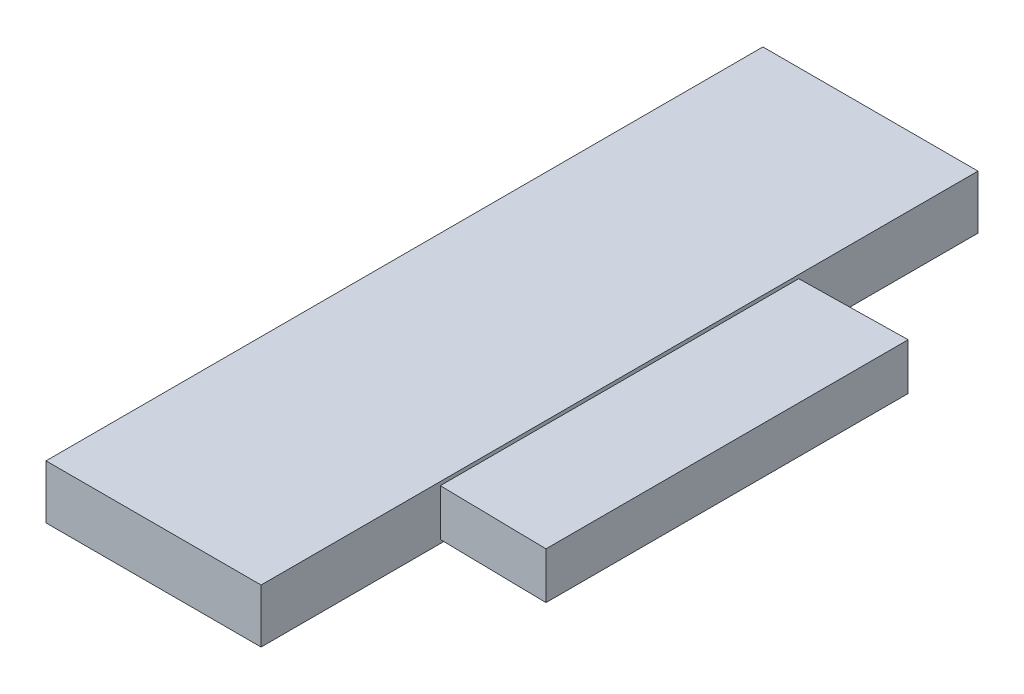
ISO-10303-21;
HEADER;
FILE_DESCRIPTION(('STEP AP214'),'2;1');
FILE_NAME('part.step','',(''),(''),'','','');
FILE_SCHEMA(('AUTOMOTIVE_DESIGN { 1 0 10303 214 1 1 1 1 }'));
ENDSEC;
DATA;
#1=APPLICATION_CONTEXT('core data for automotive mechanical design processes');
#2=APPLICATION_PROTOCOL_DEFINITION('international standard','automotive_design',2000,#1);
#3=PRODUCT_CONTEXT('',#1,'mechanical');
#4=PRODUCT('Part','Part','',(#3));
#5=PRODUCT_RELATED_PRODUCT_CATEGORY('part','',(#4));
#6=PRODUCT_DEFINITION_FORMATION('','',#4);
#7=PRODUCT_DEFINITION_CONTEXT('part definition',#1,'design');
#8=PRODUCT_DEFINITION('design','',#6,#7);
#9=PRODUCT_DEFINITION_SHAPE('','',#8);
#10=(LENGTH_UNIT() NAMED_UNIT(*) SI_UNIT(.MILLI.,.METRE.));
#11=(NAMED_UNIT(*) PLANE_ANGLE_UNIT() SI_UNIT($,.RADIAN.));
#12=(NAMED_UNIT(*) SI_UNIT($,.STERADIAN.) SOLID_ANGLE_UNIT());
#13=UNCERTAINTY_MEASURE_WITH_UNIT(LENGTH_MEASURE(1.E-05),#10,'distance_accuracy_value','');
#14=(GEOMETRIC_REPRESENTATION_CONTEXT(3) GLOBAL_UNCERTAINTY_ASSIGNED_CONTEXT((#13)) GLOBAL_UNIT_ASSIGNED_CONTEXT((#10,
#11,#12)) REPRESENTATION_CONTEXT('',''));
#15=CARTESIAN_POINT('',(0.,0.,0.));
#16=DIRECTION('',(0.,0.,1.));
#17=DIRECTION('',(1.,0.,0.));
#18=AXIS2_PLACEMENT_3D('',#15,#16,#17);
#19=CARTESIAN_POINT('',(0.,3.75,-50.));
#20=DIRECTION('',(-1.,0.,0.));
#21=DIRECTION('',(0.,0.,1.));
#22=AXIS2_PLACEMENT_3D('',#19,#20,#21);
#23=PLANE('',#22);
#24=DIRECTION('',(0.,0.,-1.));
#25=VECTOR('',#24,1.);
#26=CARTESIAN_POINT('',(0.,-3.75,-50.));
#27=LINE('',#26,#25);
#28=CARTESIAN_POINT('',(0.,-3.75,50.));
#29=VERTEX_POINT('',#28);
#30=CARTESIAN_POINT('',(0.,-3.75,-50.));
#31=VERTEX_POINT('',#30);
#32=EDGE_CURVE('E163',#29,#31,#27,.T.);
#33=ORIENTED_EDGE('',*,*,#32,.T.);
#34=DIRECTION('',(0.,-1.,0.));
#35=VECTOR('',#34,1.);
#36=CARTESIAN_POINT('',(0.,3.75,-50.));
#37=LINE('',#36,#35);
#38=CARTESIAN_POINT('',(0.,3.75,-50.));
#39=VERTEX_POINT('',#38);
#40=EDGE_CURVE('E167',#39,#31,#37,.T.);
#41=ORIENTED_EDGE('',*,*,#40,.F.);
#42=DIRECTION('',(0.,0.,-1.));
#43=VECTOR('',#42,1.);
#44=CARTESIAN_POINT('',(0.,3.75,-50.));
#45=LINE('',#44,#43);
#46=CARTESIAN_POINT('',(0.,3.75,50.));
#47=VERTEX_POINT('',#46);
#48=EDGE_CURVE('E155',#47,#39,#45,.T.);
#49=ORIENTED_EDGE('',*,*,#48,.F.);
#50=DIRECTION('',(0.,-1.,0.));
#51=VECTOR('',#50,1.);
#52=CARTESIAN_POINT('',(0.,3.75,50.));
#53=LINE('',#52,#51);
#54=EDGE_CURVE('E47',#47,#29,#53,.T.);
#55=ORIENTED_EDGE('',*,*,#54,.T.);
#56=EDGE_LOOP('',(#33,#41,#49,#55));
#57=FACE_BOUND('',#56,.T.);
#58=DIRECTION('',(0.,0.,1.));
#59=VECTOR('',#58,1.);
#60=CARTESIAN_POINT('',(0.,3.25,25.));
#61=LINE('',#60,#59);
#62=CARTESIAN_POINT('',(0.,3.25,-25.));
#63=VERTEX_POINT('',#62);
#64=CARTESIAN_POINT('',(0.,3.25,25.));
#65=VERTEX_POINT('',#64);
#66=EDGE_CURVE('E54',#63,#65,#61,.T.);
#67=ORIENTED_EDGE('',*,*,#66,.F.);
#68=DIRECTION('',(0.,1.,0.));
#69=VECTOR('',#68,1.);
#70=CARTESIAN_POINT('',(0.,-3.25,-25.));
#71=LINE('',#70,#69);
#72=CARTESIAN_POINT('',(0.,-3.25,-25.));
#73=VERTEX_POINT('',#72);
#74=EDGE_CURVE('E135',#73,#63,#71,.T.);
#75=ORIENTED_EDGE('',*,*,#74,.F.);
#76=DIRECTION('',(0.,0.,1.));
#77=VECTOR('',#76,1.);
#78=CARTESIAN_POINT('',(0.,-3.25,25.));
#79=LINE('',#78,#77);
#80=CARTESIAN_POINT('',(0.,-3.25,25.));
#81=VERTEX_POINT('',#80);
#82=EDGE_CURVE('E129',#73,#81,#79,.T.);
#83=ORIENTED_EDGE('',*,*,#82,.T.);
#84=DIRECTION('',(0.,1.,0.));
#85=VECTOR('',#84,1.);
#86=CARTESIAN_POINT('',(0.,-3.25,25.));
#87=LINE('',#86,#85);
#88=EDGE_CURVE('E115',#81,#65,#87,.T.);
#89=ORIENTED_EDGE('',*,*,#88,.T.);
#90=EDGE_LOOP('',(#67,#75,#83,#89));
#91=FACE_BOUND('',#90,.T.);
#92=ADVANCED_FACE('F39',(#57,#91),#23,.F.);
#93=CARTESIAN_POINT('',(-30.,3.75,-50.));
#94=DIRECTION('',(1.,0.,0.));
#95=DIRECTION('',(0.,0.,-1.));
#96=AXIS2_PLACEMENT_3D('',#93,#94,#95);
#97=PLANE('',#96);
#98=DIRECTION('',(0.,0.,1.));
#99=VECTOR('',#98,1.);
#100=CARTESIAN_POINT('',(-30.,-3.75,-50.));
#101=LINE('',#100,#99);
#102=CARTESIAN_POINT('',(-30.,-3.75,-50.));
#103=VERTEX_POINT('',#102);
#104=CARTESIAN_POINT('',(-30.,-3.75,50.));
#105=VERTEX_POINT('',#104);
#106=EDGE_CURVE('E148',#103,#105,#101,.T.);
#107=ORIENTED_EDGE('',*,*,#106,.T.);
#108=DIRECTION('',(0.,-1.,0.));
#109=VECTOR('',#108,1.);
#110=CARTESIAN_POINT('',(-30.,3.75,50.));
#111=LINE('',#110,#109);
#112=CARTESIAN_POINT('',(-30.,3.75,50.));
#113=VERTEX_POINT('',#112);
#114=EDGE_CURVE('E11',#113,#105,#111,.T.);
#115=ORIENTED_EDGE('',*,*,#114,.F.);
#116=DIRECTION('',(0.,0.,1.));
#117=VECTOR('',#116,1.);
#118=CARTESIAN_POINT('',(-30.,3.75,-50.));
#119=LINE('',#118,#117);
#120=CARTESIAN_POINT('',(-30.,3.75,-50.));
#121=VERTEX_POINT('',#120);
#122=EDGE_CURVE('E152',#121,#113,#119,.T.);
#123=ORIENTED_EDGE('',*,*,#122,.F.);
#124=DIRECTION('',(0.,-1.,0.));
#125=VECTOR('',#124,1.);
#126=CARTESIAN_POINT('',(-30.,3.75,-50.));
#127=LINE('',#126,#125);
#128=EDGE_CURVE('E158',#121,#103,#127,.T.);
#129=ORIENTED_EDGE('',*,*,#128,.T.);
#130=EDGE_LOOP('',(#107,#115,#123,#129));
#131=FACE_BOUND('',#130,.T.);
#132=ADVANCED_FACE('F41',(#131),#97,.F.);
#133=CARTESIAN_POINT('',(-30.,3.75,50.));
#134=DIRECTION('',(0.,0.,-1.));
#135=DIRECTION('',(-1.,0.,0.));
#136=AXIS2_PLACEMENT_3D('',#133,#134,#135);
#137=PLANE('',#136);
#138=DIRECTION('',(1.,0.,0.));
#139=VECTOR('',#138,1.);
#140=CARTESIAN_POINT('',(-30.,-3.75,50.));
#141=LINE('',#140,#139);
#142=EDGE_CURVE('E161',#105,#29,#141,.T.);
#143=ORIENTED_EDGE('',*,*,#142,.T.);
#144=ORIENTED_EDGE('',*,*,#54,.F.);
#145=DIRECTION('',(1.,0.,0.));
#146=VECTOR('',#145,1.);
#147=CARTESIAN_POINT('',(-30.,3.75,50.));
#148=LINE('',#147,#146);
#149=EDGE_CURVE('E91',#113,#47,#148,.T.);
#150=ORIENTED_EDGE('',*,*,#149,.F.);
#151=ORIENTED_EDGE('',*,*,#114,.T.);
#152=EDGE_LOOP('',(#143,#144,#150,#151));
#153=FACE_BOUND('',#152,.T.);
#154=ADVANCED_FACE('F182',(#153),#137,.F.);
#155=CARTESIAN_POINT('',(-30.,3.75,-50.));
#156=DIRECTION('',(0.,0.,1.));
#157=DIRECTION('',(1.,0.,0.));
#158=AXIS2_PLACEMENT_3D('',#155,#156,#157);
#159=PLANE('',#158);
#160=DIRECTION('',(-1.,0.,0.));
#161=VECTOR('',#160,1.);
#162=CARTESIAN_POINT('',(-30.,-3.75,-50.));
#163=LINE('',#162,#161);
#164=EDGE_CURVE('E84',#31,#103,#163,.T.);
#165=ORIENTED_EDGE('',*,*,#164,.T.);
#166=ORIENTED_EDGE('',*,*,#128,.F.);
#167=DIRECTION('',(-1.,0.,0.));
#168=VECTOR('',#167,1.);
#169=CARTESIAN_POINT('',(-30.,3.75,-50.));
#170=LINE('',#169,#168);
#171=EDGE_CURVE('E63',#39,#121,#170,.T.);
#172=ORIENTED_EDGE('',*,*,#171,.F.);
#173=ORIENTED_EDGE('',*,*,#40,.T.);
#174=EDGE_LOOP('',(#165,#166,#172,#173));
#175=FACE_BOUND('',#174,.T.);
#176=ADVANCED_FACE('F179',(#175),#159,.F.);
#177=CARTESIAN_POINT('',(0.,3.75,0.));
#178=DIRECTION('',(0.,1.,0.));
#179=DIRECTION('',(0.,0.,1.));
#180=AXIS2_PLACEMENT_3D('',#177,#178,#179);
#181=PLANE('',#180);
#182=ORIENTED_EDGE('',*,*,#122,.T.);
#183=ORIENTED_EDGE('',*,*,#149,.T.);
#184=ORIENTED_EDGE('',*,*,#48,.T.);
#185=ORIENTED_EDGE('',*,*,#171,.T.);
#186=EDGE_LOOP('',(#182,#183,#184,#185));
#187=FACE_BOUND('',#186,.T.);
#188=ADVANCED_FACE('F181',(#187),#181,.T.);
#189=CARTESIAN_POINT('',(0.,-3.75,0.));
#190=DIRECTION('',(0.,1.,0.));
#191=DIRECTION('',(0.,0.,1.));
#192=AXIS2_PLACEMENT_3D('',#189,#190,#191);
#193=PLANE('',#192);
#194=ORIENTED_EDGE('',*,*,#106,.F.);
#195=ORIENTED_EDGE('',*,*,#164,.F.);
#196=ORIENTED_EDGE('',*,*,#32,.F.);
#197=ORIENTED_EDGE('',*,*,#142,.F.);
#198=EDGE_LOOP('',(#194,#195,#196,#197));
#199=FACE_BOUND('',#198,.T.);
#200=ADVANCED_FACE('F175',(#199),#193,.F.);
#201=CARTESIAN_POINT('',(0.,-3.25,-25.));
#202=DIRECTION('',(-0.0174524064372792,0.,-0.999847695156391));
#203=DIRECTION('',(-0.999847695156391,0.,0.0174524064372792));
#204=AXIS2_PLACEMENT_3D('',#201,#202,#203);
#205=PLANE('',#204);
#206=DIRECTION('',(-0.999847695156391,0.,0.0174524064372792));
#207=VECTOR('',#206,1.);
#208=CARTESIAN_POINT('',(0.,3.25,-25.));
#209=LINE('',#208,#207);
#210=CARTESIAN_POINT('',(15.,3.25,-25.2618259739232));
#211=VERTEX_POINT('',#210);
#212=EDGE_CURVE('E136',#211,#63,#209,.T.);
#213=ORIENTED_EDGE('',*,*,#212,.F.);
#214=DIRECTION('',(0.,1.,0.));
#215=VECTOR('',#214,1.);
#216=CARTESIAN_POINT('',(15.,-3.25,-25.2618259739232));
#217=LINE('',#216,#215);
#218=CARTESIAN_POINT('',(15.,-3.25,-25.2618259739232));
#219=VERTEX_POINT('',#218);
#220=EDGE_CURVE('E149',#219,#211,#217,.T.);
#221=ORIENTED_EDGE('',*,*,#220,.F.);
#222=DIRECTION('',(-0.999847695156391,0.,0.0174524064372792));
#223=VECTOR('',#222,1.);
#224=CARTESIAN_POINT('',(0.,-3.25,-25.));
#225=LINE('',#224,#223);
#226=EDGE_CURVE('E123',#219,#73,#225,.T.);
#227=ORIENTED_EDGE('',*,*,#226,.T.);
#228=ORIENTED_EDGE('',*,*,#74,.T.);
#229=EDGE_LOOP('',(#213,#221,#227,#228));
#230=FACE_BOUND('',#229,.T.);
#231=ADVANCED_FACE('F220',(#230),#205,.T.);
#232=CARTESIAN_POINT('',(15.,-3.25,-25.2618259739232));
#233=DIRECTION('',(1.,0.,0.));
#234=DIRECTION('',(0.,0.,-1.));
#235=AXIS2_PLACEMENT_3D('',#232,#233,#234);
#236=PLANE('',#235);
#237=DIRECTION('',(0.,0.,-1.));
#238=VECTOR('',#237,1.);
#239=CARTESIAN_POINT('',(15.,3.25,-25.2618259739232));
#240=LINE('',#239,#238);
#241=CARTESIAN_POINT('',(15.,3.25,25.2618259739232));
#242=VERTEX_POINT('',#241);
#243=EDGE_CURVE('E138',#242,#211,#240,.T.);
#244=ORIENTED_EDGE('',*,*,#243,.F.);
#245=DIRECTION('',(0.,1.,0.));
#246=VECTOR('',#245,1.);
#247=CARTESIAN_POINT('',(15.,-3.25,25.2618259739232));
#248=LINE('',#247,#246);
#249=CARTESIAN_POINT('',(15.,-3.25,25.2618259739232));
#250=VERTEX_POINT('',#249);
#251=EDGE_CURVE('E122',#250,#242,#248,.T.);
#252=ORIENTED_EDGE('',*,*,#251,.F.);
#253=DIRECTION('',(0.,0.,-1.));
#254=VECTOR('',#253,1.);
#255=CARTESIAN_POINT('',(15.,-3.25,-25.2618259739232));
#256=LINE('',#255,#254);
#257=EDGE_CURVE('E132',#250,#219,#256,.T.);
#258=ORIENTED_EDGE('',*,*,#257,.T.);
#259=ORIENTED_EDGE('',*,*,#220,.T.);
#260=EDGE_LOOP('',(#244,#252,#258,#259));
#261=FACE_BOUND('',#260,.T.);
#262=ADVANCED_FACE('F232',(#261),#236,.T.);
#263=CARTESIAN_POINT('',(15.,-3.25,25.2618259739232));
#264=DIRECTION('',(-0.0174524064372792,0.,0.999847695156391));
#265=DIRECTION('',(0.999847695156391,0.,0.0174524064372792));
#266=AXIS2_PLACEMENT_3D('',#263,#264,#265);
#267=PLANE('',#266);
#268=DIRECTION('',(0.999847695156391,0.,0.0174524064372792));
#269=VECTOR('',#268,1.);
#270=CARTESIAN_POINT('',(15.,3.25,25.2618259739232));
#271=LINE('',#270,#269);
#272=EDGE_CURVE('E119',#65,#242,#271,.T.);
#273=ORIENTED_EDGE('',*,*,#272,.F.);
#274=ORIENTED_EDGE('',*,*,#88,.F.);
#275=DIRECTION('',(0.999847695156391,0.,0.0174524064372792));
#276=VECTOR('',#275,1.);
#277=CARTESIAN_POINT('',(15.,-3.25,25.2618259739232));
#278=LINE('',#277,#276);
#279=EDGE_CURVE('E118',#81,#250,#278,.T.);
#280=ORIENTED_EDGE('',*,*,#279,.T.);
#281=ORIENTED_EDGE('',*,*,#251,.T.);
#282=EDGE_LOOP('',(#273,#274,#280,#281));
#283=FACE_BOUND('',#282,.T.);
#284=ADVANCED_FACE('F117',(#283),#267,.T.);
#285=CARTESIAN_POINT('',(0.,-3.25,0.));
#286=DIRECTION('',(0.,-1.,0.));
#287=DIRECTION('',(0.,0.,-1.));
#288=AXIS2_PLACEMENT_3D('',#285,#286,#287);
#289=PLANE('',#288);
#290=ORIENTED_EDGE('',*,*,#82,.F.);
#291=ORIENTED_EDGE('',*,*,#226,.F.);
#292=ORIENTED_EDGE('',*,*,#257,.F.);
#293=ORIENTED_EDGE('',*,*,#279,.F.);
#294=EDGE_LOOP('',(#290,#291,#292,#293));
#295=FACE_BOUND('',#294,.T.);
#296=ADVANCED_FACE('F127',(#295),#289,.T.);
#297=CARTESIAN_POINT('',(0.,3.25,0.));
#298=DIRECTION('',(0.,-1.,0.));
#299=DIRECTION('',(0.,0.,-1.));
#300=AXIS2_PLACEMENT_3D('',#297,#298,#299);
#301=PLANE('',#300);
#302=ORIENTED_EDGE('',*,*,#66,.T.);
#303=ORIENTED_EDGE('',*,*,#272,.T.);
#304=ORIENTED_EDGE('',*,*,#243,.T.);
#305=ORIENTED_EDGE('',*,*,#212,.T.);
#306=EDGE_LOOP('',(#302,#303,#304,#305));
#307=FACE_BOUND('',#306,.T.);
#308=ADVANCED_FACE('F252',(#307),#301,.F.);
#309=CLOSED_SHELL('',(#92,#132,#154,#176,#188,#200,#231,#262,#284,#296,#308));
#310=MANIFOLD_SOLID_BREP('B2',#309);
#311=ADVANCED_BREP_SHAPE_REPRESENTATION('',(#18,#310),#14);
#312=SHAPE_DEFINITION_REPRESENTATION(#9,#311);
ENDSEC;
END-ISO-10303-21;
